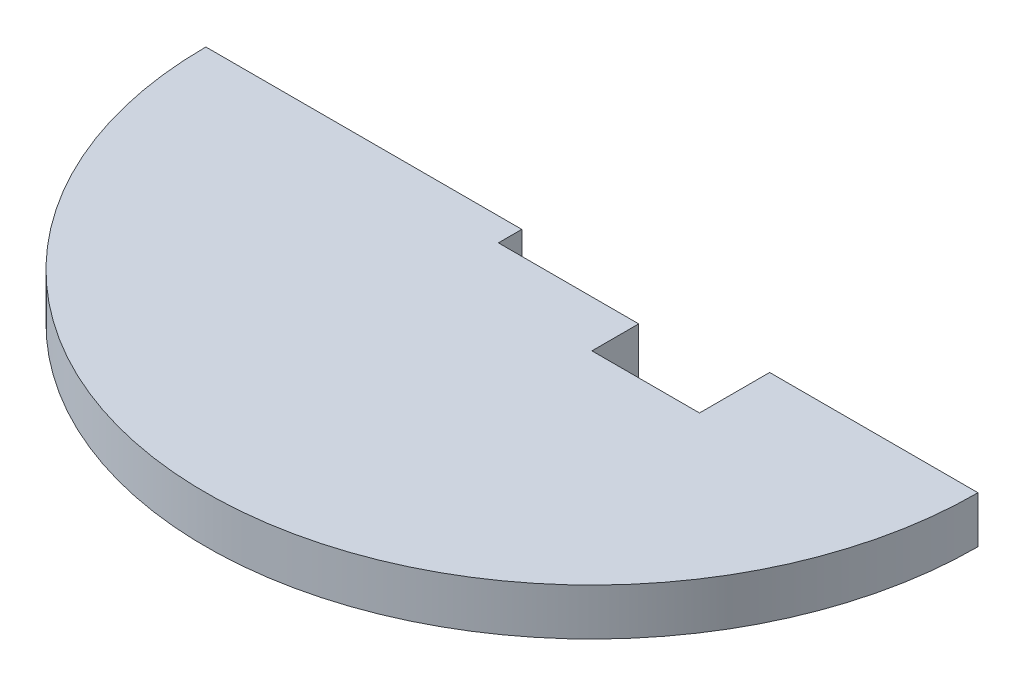
ISO-10303-21;
HEADER;
FILE_DESCRIPTION(('STEP AP214'),'2;1');
FILE_NAME('part.step','',(''),(''),'','','');
FILE_SCHEMA(('AUTOMOTIVE_DESIGN { 1 0 10303 214 1 1 1 1 }'));
ENDSEC;
DATA;
#1=APPLICATION_CONTEXT('core data for automotive mechanical design processes');
#2=APPLICATION_PROTOCOL_DEFINITION('international standard','automotive_design',2000,#1);
#3=PRODUCT_CONTEXT('',#1,'mechanical');
#4=PRODUCT('Part','Part','',(#3));
#5=PRODUCT_RELATED_PRODUCT_CATEGORY('part','',(#4));
#6=PRODUCT_DEFINITION_FORMATION('','',#4);
#7=PRODUCT_DEFINITION_CONTEXT('part definition',#1,'design');
#8=PRODUCT_DEFINITION('design','',#6,#7);
#9=PRODUCT_DEFINITION_SHAPE('','',#8);
#10=(LENGTH_UNIT() NAMED_UNIT(*) SI_UNIT(.MILLI.,.METRE.));
#11=(NAMED_UNIT(*) PLANE_ANGLE_UNIT() SI_UNIT($,.RADIAN.));
#12=(NAMED_UNIT(*) SI_UNIT($,.STERADIAN.) SOLID_ANGLE_UNIT());
#13=UNCERTAINTY_MEASURE_WITH_UNIT(LENGTH_MEASURE(1.E-05),#10,'distance_accuracy_value','');
#14=(GEOMETRIC_REPRESENTATION_CONTEXT(3) GLOBAL_UNCERTAINTY_ASSIGNED_CONTEXT((#13)) GLOBAL_UNIT_ASSIGNED_CONTEXT((#10,
#11,#12)) REPRESENTATION_CONTEXT('',''));
#15=CARTESIAN_POINT('',(0.,0.,0.));
#16=DIRECTION('',(0.,0.,1.));
#17=DIRECTION('',(1.,0.,0.));
#18=AXIS2_PLACEMENT_3D('',#15,#16,#17);
#19=CARTESIAN_POINT('',(0.,10.,0.));
#20=DIRECTION('',(0.,-1.,0.));
#21=DIRECTION('',(0.,0.,-1.));
#22=AXIS2_PLACEMENT_3D('',#19,#20,#21);
#23=CYLINDRICAL_SURFACE('',#22,82.55);
#24=CARTESIAN_POINT('',(0.,0.,0.));
#25=DIRECTION('',(0.,1.,0.));
#26=DIRECTION('',(0.,0.,1.));
#27=AXIS2_PLACEMENT_3D('',#24,#25,#26);
#28=CIRCLE('',#27,82.55);
#29=CARTESIAN_POINT('',(-82.55,0.,0.));
#30=VERTEX_POINT('',#29);
#31=CARTESIAN_POINT('',(82.55,0.,0.));
#32=VERTEX_POINT('',#31);
#33=EDGE_CURVE('E153',#30,#32,#28,.T.);
#34=ORIENTED_EDGE('',*,*,#33,.T.);
#35=DIRECTION('',(0.,1.,0.));
#36=VECTOR('',#35,1.);
#37=CARTESIAN_POINT('',(82.55,0.,0.));
#38=LINE('',#37,#36);
#39=CARTESIAN_POINT('',(82.55,10.,0.));
#40=VERTEX_POINT('',#39);
#41=EDGE_CURVE('E133',#32,#40,#38,.T.);
#42=ORIENTED_EDGE('',*,*,#41,.T.);
#43=CARTESIAN_POINT('',(0.,10.,0.));
#44=DIRECTION('',(0.,1.,0.));
#45=DIRECTION('',(0.,0.,1.));
#46=AXIS2_PLACEMENT_3D('',#43,#44,#45);
#47=CIRCLE('',#46,82.55);
#48=CARTESIAN_POINT('',(-82.55,10.,0.));
#49=VERTEX_POINT('',#48);
#50=EDGE_CURVE('E39',#49,#40,#47,.T.);
#51=ORIENTED_EDGE('',*,*,#50,.F.);
#52=DIRECTION('',(0.,1.,0.));
#53=VECTOR('',#52,1.);
#54=CARTESIAN_POINT('',(-82.55,0.,0.));
#55=LINE('',#54,#53);
#56=EDGE_CURVE('E139',#30,#49,#55,.T.);
#57=ORIENTED_EDGE('',*,*,#56,.F.);
#58=EDGE_LOOP('',(#34,#42,#51,#57));
#59=FACE_BOUND('',#58,.T.);
#60=ADVANCED_FACE('F32',(#59),#23,.T.);
#61=CARTESIAN_POINT('',(0.,10.,0.));
#62=DIRECTION('',(0.,1.,0.));
#63=DIRECTION('',(0.,0.,1.));
#64=AXIS2_PLACEMENT_3D('',#61,#62,#63);
#65=PLANE('',#64);
#66=DIRECTION('',(0.,0.,1.));
#67=VECTOR('',#66,1.);
#68=CARTESIAN_POINT('',(15.,10.,-15.));
#69=LINE('',#68,#67);
#70=CARTESIAN_POINT('',(15.,10.,4.99999999999999));
#71=VERTEX_POINT('',#70);
#72=CARTESIAN_POINT('',(15.,10.,15.));
#73=VERTEX_POINT('',#72);
#74=EDGE_CURVE('E101',#71,#73,#69,.T.);
#75=ORIENTED_EDGE('',*,*,#74,.F.);
#76=DIRECTION('',(1.,0.,0.));
#77=VECTOR('',#76,1.);
#78=CARTESIAN_POINT('',(0.,10.,5.));
#79=LINE('',#78,#77);
#80=CARTESIAN_POINT('',(-15.,10.,5.));
#81=VERTEX_POINT('',#80);
#82=EDGE_CURVE('E150',#81,#71,#79,.T.);
#83=ORIENTED_EDGE('',*,*,#82,.F.);
#84=DIRECTION('',(0.,0.,1.));
#85=VECTOR('',#84,1.);
#86=CARTESIAN_POINT('',(-15.,10.,0.));
#87=LINE('',#86,#85);
#88=CARTESIAN_POINT('',(-15.,10.,0.));
#89=VERTEX_POINT('',#88);
#90=EDGE_CURVE('E146',#89,#81,#87,.T.);
#91=ORIENTED_EDGE('',*,*,#90,.F.);
#92=DIRECTION('',(1.,0.,0.));
#93=VECTOR('',#92,1.);
#94=CARTESIAN_POINT('',(0.,10.,0.));
#95=LINE('',#94,#93);
#96=EDGE_CURVE('E53',#49,#89,#95,.T.);
#97=ORIENTED_EDGE('',*,*,#96,.F.);
#98=ORIENTED_EDGE('',*,*,#50,.T.);
#99=CARTESIAN_POINT('',(38.,10.,0.));
#100=VERTEX_POINT('',#99);
#101=EDGE_CURVE('E131',#100,#40,#95,.T.);
#102=ORIENTED_EDGE('',*,*,#101,.F.);
#103=DIRECTION('',(0.,0.,-1.));
#104=VECTOR('',#103,1.);
#105=CARTESIAN_POINT('',(38.,10.,-15.));
#106=LINE('',#105,#104);
#107=CARTESIAN_POINT('',(38.,10.,15.));
#108=VERTEX_POINT('',#107);
#109=EDGE_CURVE('E46',#108,#100,#106,.T.);
#110=ORIENTED_EDGE('',*,*,#109,.F.);
#111=DIRECTION('',(1.,0.,0.));
#112=VECTOR('',#111,1.);
#113=CARTESIAN_POINT('',(15.,10.,15.));
#114=LINE('',#113,#112);
#115=EDGE_CURVE('E120',#73,#108,#114,.T.);
#116=ORIENTED_EDGE('',*,*,#115,.F.);
#117=EDGE_LOOP('',(#75,#83,#91,#97,#98,#102,#110,#116));
#118=FACE_BOUND('',#117,.T.);
#119=ADVANCED_FACE('F167',(#118),#65,.T.);
#120=CARTESIAN_POINT('',(0.,0.,0.));
#121=DIRECTION('',(0.,1.,0.));
#122=DIRECTION('',(0.,0.,1.));
#123=AXIS2_PLACEMENT_3D('',#120,#121,#122);
#124=PLANE('',#123);
#125=DIRECTION('',(1.,0.,0.));
#126=VECTOR('',#125,1.);
#127=CARTESIAN_POINT('',(-15.,0.,5.));
#128=LINE('',#127,#126);
#129=CARTESIAN_POINT('',(-15.,0.,5.));
#130=VERTEX_POINT('',#129);
#131=CARTESIAN_POINT('',(15.,0.,4.99999999999999));
#132=VERTEX_POINT('',#131);
#133=EDGE_CURVE('E118',#130,#132,#128,.T.);
#134=ORIENTED_EDGE('',*,*,#133,.T.);
#135=DIRECTION('',(0.,0.,1.));
#136=VECTOR('',#135,1.);
#137=CARTESIAN_POINT('',(15.,0.,-15.));
#138=LINE('',#137,#136);
#139=CARTESIAN_POINT('',(15.,0.,15.));
#140=VERTEX_POINT('',#139);
#141=EDGE_CURVE('E98',#132,#140,#138,.T.);
#142=ORIENTED_EDGE('',*,*,#141,.T.);
#143=DIRECTION('',(1.,0.,0.));
#144=VECTOR('',#143,1.);
#145=CARTESIAN_POINT('',(15.,0.,15.));
#146=LINE('',#145,#144);
#147=CARTESIAN_POINT('',(38.,0.,15.));
#148=VERTEX_POINT('',#147);
#149=EDGE_CURVE('E109',#140,#148,#146,.T.);
#150=ORIENTED_EDGE('',*,*,#149,.T.);
#151=DIRECTION('',(0.,0.,-1.));
#152=VECTOR('',#151,1.);
#153=CARTESIAN_POINT('',(38.,0.,-15.));
#154=LINE('',#153,#152);
#155=CARTESIAN_POINT('',(38.,0.,0.));
#156=VERTEX_POINT('',#155);
#157=EDGE_CURVE('E106',#148,#156,#154,.T.);
#158=ORIENTED_EDGE('',*,*,#157,.T.);
#159=DIRECTION('',(1.,0.,0.));
#160=VECTOR('',#159,1.);
#161=CARTESIAN_POINT('',(0.,0.,0.));
#162=LINE('',#161,#160);
#163=EDGE_CURVE('E130',#156,#32,#162,.T.);
#164=ORIENTED_EDGE('',*,*,#163,.T.);
#165=ORIENTED_EDGE('',*,*,#33,.F.);
#166=CARTESIAN_POINT('',(-15.,0.,0.));
#167=VERTEX_POINT('',#166);
#168=EDGE_CURVE('E127',#30,#167,#162,.T.);
#169=ORIENTED_EDGE('',*,*,#168,.T.);
#170=DIRECTION('',(0.,0.,1.));
#171=VECTOR('',#170,1.);
#172=CARTESIAN_POINT('',(-15.,0.,-5.));
#173=LINE('',#172,#171);
#174=EDGE_CURVE('E136',#167,#130,#173,.T.);
#175=ORIENTED_EDGE('',*,*,#174,.T.);
#176=EDGE_LOOP('',(#134,#142,#150,#158,#164,#165,#169,#175));
#177=FACE_BOUND('',#176,.T.);
#178=ADVANCED_FACE('F116',(#177),#124,.F.);
#179=CARTESIAN_POINT('',(-15.,0.,5.));
#180=DIRECTION('',(0.,0.,1.));
#181=DIRECTION('',(1.,0.,0.));
#182=AXIS2_PLACEMENT_3D('',#179,#180,#181);
#183=PLANE('',#182);
#184=ORIENTED_EDGE('',*,*,#82,.T.);
#185=DIRECTION('',(0.,1.,0.));
#186=VECTOR('',#185,1.);
#187=CARTESIAN_POINT('',(15.,0.,5.));
#188=LINE('',#187,#186);
#189=EDGE_CURVE('E144',#132,#71,#188,.T.);
#190=ORIENTED_EDGE('',*,*,#189,.F.);
#191=ORIENTED_EDGE('',*,*,#133,.F.);
#192=DIRECTION('',(0.,1.,0.));
#193=VECTOR('',#192,1.);
#194=CARTESIAN_POINT('',(-15.,0.,5.));
#195=LINE('',#194,#193);
#196=EDGE_CURVE('E143',#130,#81,#195,.T.);
#197=ORIENTED_EDGE('',*,*,#196,.T.);
#198=EDGE_LOOP('',(#184,#190,#191,#197));
#199=FACE_BOUND('',#198,.T.);
#200=ADVANCED_FACE('F174',(#199),#183,.F.);
#201=CARTESIAN_POINT('',(-15.,0.,-5.));
#202=DIRECTION('',(-1.,0.,0.));
#203=DIRECTION('',(0.,0.,1.));
#204=AXIS2_PLACEMENT_3D('',#201,#202,#203);
#205=PLANE('',#204);
#206=ORIENTED_EDGE('',*,*,#174,.F.);
#207=DIRECTION('',(0.,1.,0.));
#208=VECTOR('',#207,1.);
#209=CARTESIAN_POINT('',(-15.,0.,0.));
#210=LINE('',#209,#208);
#211=EDGE_CURVE('E137',#167,#89,#210,.T.);
#212=ORIENTED_EDGE('',*,*,#211,.T.);
#213=ORIENTED_EDGE('',*,*,#90,.T.);
#214=ORIENTED_EDGE('',*,*,#196,.F.);
#215=EDGE_LOOP('',(#206,#212,#213,#214));
#216=FACE_BOUND('',#215,.T.);
#217=ADVANCED_FACE('F172',(#216),#205,.F.);
#218=CARTESIAN_POINT('',(0.,0.,0.));
#219=DIRECTION('',(0.,0.,1.));
#220=DIRECTION('',(1.,0.,0.));
#221=AXIS2_PLACEMENT_3D('',#218,#219,#220);
#222=PLANE('',#221);
#223=ORIENTED_EDGE('',*,*,#96,.T.);
#224=ORIENTED_EDGE('',*,*,#211,.F.);
#225=ORIENTED_EDGE('',*,*,#168,.F.);
#226=ORIENTED_EDGE('',*,*,#56,.T.);
#227=EDGE_LOOP('',(#223,#224,#225,#226));
#228=FACE_BOUND('',#227,.T.);
#229=ADVANCED_FACE('F182',(#228),#222,.F.);
#230=ORIENTED_EDGE('',*,*,#163,.F.);
#231=DIRECTION('',(0.,1.,0.));
#232=VECTOR('',#231,1.);
#233=CARTESIAN_POINT('',(38.,0.,0.));
#234=LINE('',#233,#232);
#235=EDGE_CURVE('E11',#156,#100,#234,.T.);
#236=ORIENTED_EDGE('',*,*,#235,.T.);
#237=ORIENTED_EDGE('',*,*,#101,.T.);
#238=ORIENTED_EDGE('',*,*,#41,.F.);
#239=EDGE_LOOP('',(#230,#236,#237,#238));
#240=FACE_BOUND('',#239,.T.);
#241=ADVANCED_FACE('F164',(#240),#222,.F.);
#242=CARTESIAN_POINT('',(15.,0.,-15.));
#243=DIRECTION('',(-1.,0.,0.));
#244=DIRECTION('',(0.,0.,1.));
#245=AXIS2_PLACEMENT_3D('',#242,#243,#244);
#246=PLANE('',#245);
#247=ORIENTED_EDGE('',*,*,#74,.T.);
#248=DIRECTION('',(0.,1.,0.));
#249=VECTOR('',#248,1.);
#250=CARTESIAN_POINT('',(15.,0.,15.));
#251=LINE('',#250,#249);
#252=EDGE_CURVE('E94',#140,#73,#251,.T.);
#253=ORIENTED_EDGE('',*,*,#252,.F.);
#254=ORIENTED_EDGE('',*,*,#141,.F.);
#255=ORIENTED_EDGE('',*,*,#189,.T.);
#256=EDGE_LOOP('',(#247,#253,#254,#255));
#257=FACE_BOUND('',#256,.T.);
#258=ADVANCED_FACE('F96',(#257),#246,.F.);
#259=CARTESIAN_POINT('',(38.,0.,-15.));
#260=DIRECTION('',(1.,0.,0.));
#261=DIRECTION('',(0.,0.,-1.));
#262=AXIS2_PLACEMENT_3D('',#259,#260,#261);
#263=PLANE('',#262);
#264=ORIENTED_EDGE('',*,*,#157,.F.);
#265=DIRECTION('',(0.,1.,0.));
#266=VECTOR('',#265,1.);
#267=CARTESIAN_POINT('',(38.,0.,15.));
#268=LINE('',#267,#266);
#269=EDGE_CURVE('E105',#148,#108,#268,.T.);
#270=ORIENTED_EDGE('',*,*,#269,.T.);
#271=ORIENTED_EDGE('',*,*,#109,.T.);
#272=ORIENTED_EDGE('',*,*,#235,.F.);
#273=EDGE_LOOP('',(#264,#270,#271,#272));
#274=FACE_BOUND('',#273,.T.);
#275=ADVANCED_FACE('F224',(#274),#263,.F.);
#276=CARTESIAN_POINT('',(15.,0.,15.));
#277=DIRECTION('',(0.,0.,1.));
#278=DIRECTION('',(1.,0.,0.));
#279=AXIS2_PLACEMENT_3D('',#276,#277,#278);
#280=PLANE('',#279);
#281=ORIENTED_EDGE('',*,*,#115,.T.);
#282=ORIENTED_EDGE('',*,*,#269,.F.);
#283=ORIENTED_EDGE('',*,*,#149,.F.);
#284=ORIENTED_EDGE('',*,*,#252,.T.);
#285=EDGE_LOOP('',(#281,#282,#283,#284));
#286=FACE_BOUND('',#285,.T.);
#287=ADVANCED_FACE('F110',(#286),#280,.F.);
#288=CLOSED_SHELL('',(#60,#119,#178,#200,#217,#229,#241,#258,#275,#287));
#289=MANIFOLD_SOLID_BREP('B2',#288);
#290=ADVANCED_BREP_SHAPE_REPRESENTATION('',(#18,#289),#14);
#291=SHAPE_DEFINITION_REPRESENTATION(#9,#290);
ENDSEC;
END-ISO-10303-21;
